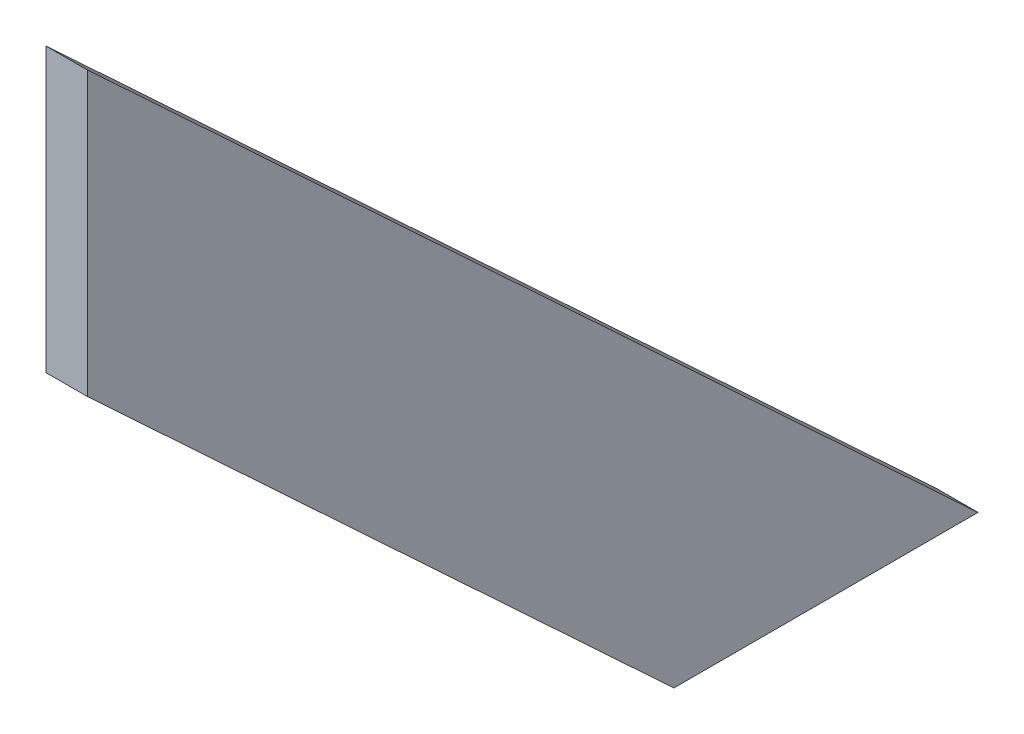
ISO-10303-21;
HEADER;
FILE_DESCRIPTION(('STEP AP214'),'2;1');
FILE_NAME('part.step','',(''),(''),'','','');
FILE_SCHEMA(('AUTOMOTIVE_DESIGN { 1 0 10303 214 1 1 1 1 }'));
ENDSEC;
DATA;
#1=APPLICATION_CONTEXT('core data for automotive mechanical design processes');
#2=APPLICATION_PROTOCOL_DEFINITION('international standard','automotive_design',2000,#1);
#3=PRODUCT_CONTEXT('',#1,'mechanical');
#4=PRODUCT('Part','Part','',(#3));
#5=PRODUCT_RELATED_PRODUCT_CATEGORY('part','',(#4));
#6=PRODUCT_DEFINITION_FORMATION('','',#4);
#7=PRODUCT_DEFINITION_CONTEXT('part definition',#1,'design');
#8=PRODUCT_DEFINITION('design','',#6,#7);
#9=PRODUCT_DEFINITION_SHAPE('','',#8);
#10=(LENGTH_UNIT() NAMED_UNIT(*) SI_UNIT(.MILLI.,.METRE.));
#11=(NAMED_UNIT(*) PLANE_ANGLE_UNIT() SI_UNIT($,.RADIAN.));
#12=(NAMED_UNIT(*) SI_UNIT($,.STERADIAN.) SOLID_ANGLE_UNIT());
#13=UNCERTAINTY_MEASURE_WITH_UNIT(LENGTH_MEASURE(1.E-05),#10,'distance_accuracy_value','');
#14=(GEOMETRIC_REPRESENTATION_CONTEXT(3) GLOBAL_UNCERTAINTY_ASSIGNED_CONTEXT((#13)) GLOBAL_UNIT_ASSIGNED_CONTEXT((#10,
#11,#12)) REPRESENTATION_CONTEXT('',''));
#15=CARTESIAN_POINT('',(0.,0.,0.));
#16=DIRECTION('',(0.,0.,1.));
#17=DIRECTION('',(1.,0.,0.));
#18=AXIS2_PLACEMENT_3D('',#15,#16,#17);
#19=CARTESIAN_POINT('',(2.,0.,-43.));
#20=DIRECTION('',(0.,-0.732186738163084,0.681103942477287));
#21=DIRECTION('',(0.,-0.681103942477287,-0.732186738163084));
#22=AXIS2_PLACEMENT_3D('',#19,#20,#21);
#23=PLANE('',#22);
#24=DIRECTION('',(0.,0.681103942477287,0.732186738163084));
#25=VECTOR('',#24,1.);
#26=CARTESIAN_POINT('',(0.,0.,-43.));
#27=LINE('',#26,#25);
#28=CARTESIAN_POINT('',(0.,0.,-43.));
#29=VERTEX_POINT('',#28);
#30=CARTESIAN_POINT('',(0.,40.,0.));
#31=VERTEX_POINT('',#30);
#32=EDGE_CURVE('E107',#29,#31,#27,.T.);
#33=ORIENTED_EDGE('',*,*,#32,.T.);
#34=DIRECTION('',(-1.,0.,0.));
#35=VECTOR('',#34,1.);
#36=CARTESIAN_POINT('',(2.,40.,0.));
#37=LINE('',#36,#35);
#38=CARTESIAN_POINT('',(2.,40.,0.));
#39=VERTEX_POINT('',#38);
#40=EDGE_CURVE('E11',#39,#31,#37,.T.);
#41=ORIENTED_EDGE('',*,*,#40,.F.);
#42=DIRECTION('',(0.,0.681103942477287,0.732186738163084));
#43=VECTOR('',#42,1.);
#44=CARTESIAN_POINT('',(2.,0.,-43.));
#45=LINE('',#44,#43);
#46=CARTESIAN_POINT('',(2.,0.,-43.));
#47=VERTEX_POINT('',#46);
#48=EDGE_CURVE('E91',#47,#39,#45,.T.);
#49=ORIENTED_EDGE('',*,*,#48,.F.);
#50=DIRECTION('',(-1.,0.,0.));
#51=VECTOR('',#50,1.);
#52=CARTESIAN_POINT('',(2.,0.,-43.));
#53=LINE('',#52,#51);
#54=EDGE_CURVE('E103',#47,#29,#53,.T.);
#55=ORIENTED_EDGE('',*,*,#54,.T.);
#56=EDGE_LOOP('',(#33,#41,#49,#55));
#57=FACE_BOUND('',#56,.T.);
#58=ADVANCED_FACE('F39',(#57),#23,.F.);
#59=CARTESIAN_POINT('',(2.,40.,0.));
#60=DIRECTION('',(0.,0.,-1.));
#61=DIRECTION('',(0.,1.,0.));
#62=AXIS2_PLACEMENT_3D('',#59,#60,#61);
#63=PLANE('',#62);
#64=DIRECTION('',(0.,-1.,0.));
#65=VECTOR('',#64,1.);
#66=CARTESIAN_POINT('',(0.,40.,0.));
#67=LINE('',#66,#65);
#68=CARTESIAN_POINT('',(0.,26.3422819906735,0.));
#69=VERTEX_POINT('',#68);
#70=EDGE_CURVE('E96',#31,#69,#67,.T.);
#71=ORIENTED_EDGE('',*,*,#70,.T.);
#72=DIRECTION('',(-1.,0.,0.));
#73=VECTOR('',#72,1.);
#74=CARTESIAN_POINT('',(2.,26.3422819906735,0.));
#75=LINE('',#74,#73);
#76=CARTESIAN_POINT('',(2.,26.3422819906735,0.));
#77=VERTEX_POINT('',#76);
#78=EDGE_CURVE('E48',#77,#69,#75,.T.);
#79=ORIENTED_EDGE('',*,*,#78,.F.);
#80=DIRECTION('',(0.,-1.,0.));
#81=VECTOR('',#80,1.);
#82=CARTESIAN_POINT('',(2.,40.,0.));
#83=LINE('',#82,#81);
#84=EDGE_CURVE('E86',#39,#77,#83,.T.);
#85=ORIENTED_EDGE('',*,*,#84,.F.);
#86=ORIENTED_EDGE('',*,*,#40,.T.);
#87=EDGE_LOOP('',(#71,#79,#85,#86));
#88=FACE_BOUND('',#87,.T.);
#89=ADVANCED_FACE('F95',(#88),#63,.F.);
#90=CARTESIAN_POINT('',(2.,26.3422819906735,0.));
#91=DIRECTION('',(0.,0.732186738163084,-0.681103942477287));
#92=DIRECTION('',(0.,0.681103942477287,0.732186738163084));
#93=AXIS2_PLACEMENT_3D('',#90,#91,#92);
#94=PLANE('',#93);
#95=DIRECTION('',(0.,-0.681103942477287,-0.732186738163084));
#96=VECTOR('',#95,1.);
#97=CARTESIAN_POINT('',(0.,26.3422819906735,0.));
#98=LINE('',#97,#96);
#99=CARTESIAN_POINT('',(0.,0.,-28.317953139974));
#100=VERTEX_POINT('',#99);
#101=EDGE_CURVE('E73',#69,#100,#98,.T.);
#102=ORIENTED_EDGE('',*,*,#101,.T.);
#103=DIRECTION('',(-1.,0.,0.));
#104=VECTOR('',#103,1.);
#105=CARTESIAN_POINT('',(2.,0.,-28.317953139974));
#106=LINE('',#105,#104);
#107=CARTESIAN_POINT('',(2.,0.,-28.317953139974));
#108=VERTEX_POINT('',#107);
#109=EDGE_CURVE('E98',#108,#100,#106,.T.);
#110=ORIENTED_EDGE('',*,*,#109,.F.);
#111=DIRECTION('',(0.,-0.681103942477287,-0.732186738163084));
#112=VECTOR('',#111,1.);
#113=CARTESIAN_POINT('',(2.,26.3422819906735,0.));
#114=LINE('',#113,#112);
#115=EDGE_CURVE('E89',#77,#108,#114,.T.);
#116=ORIENTED_EDGE('',*,*,#115,.F.);
#117=ORIENTED_EDGE('',*,*,#78,.T.);
#118=EDGE_LOOP('',(#102,#110,#116,#117));
#119=FACE_BOUND('',#118,.T.);
#120=ADVANCED_FACE('F99',(#119),#94,.F.);
#121=CARTESIAN_POINT('',(2.,0.,-28.317953139974));
#122=DIRECTION('',(0.,1.,0.));
#123=DIRECTION('',(0.,0.,1.));
#124=AXIS2_PLACEMENT_3D('',#121,#122,#123);
#125=PLANE('',#124);
#126=DIRECTION('',(0.,0.,-1.));
#127=VECTOR('',#126,1.);
#128=CARTESIAN_POINT('',(0.,0.,-28.317953139974));
#129=LINE('',#128,#127);
#130=EDGE_CURVE('E79',#100,#29,#129,.T.);
#131=ORIENTED_EDGE('',*,*,#130,.T.);
#132=ORIENTED_EDGE('',*,*,#54,.F.);
#133=DIRECTION('',(0.,0.,-1.));
#134=VECTOR('',#133,1.);
#135=CARTESIAN_POINT('',(2.,0.,-28.317953139974));
#136=LINE('',#135,#134);
#137=EDGE_CURVE('E56',#108,#47,#136,.T.);
#138=ORIENTED_EDGE('',*,*,#137,.F.);
#139=ORIENTED_EDGE('',*,*,#109,.T.);
#140=EDGE_LOOP('',(#131,#132,#138,#139));
#141=FACE_BOUND('',#140,.T.);
#142=ADVANCED_FACE('F120',(#141),#125,.F.);
#143=CARTESIAN_POINT('',(2.,0.,0.));
#144=DIRECTION('',(1.,0.,0.));
#145=DIRECTION('',(0.,0.,-1.));
#146=AXIS2_PLACEMENT_3D('',#143,#144,#145);
#147=PLANE('',#146);
#148=ORIENTED_EDGE('',*,*,#48,.T.);
#149=ORIENTED_EDGE('',*,*,#84,.T.);
#150=ORIENTED_EDGE('',*,*,#115,.T.);
#151=ORIENTED_EDGE('',*,*,#137,.T.);
#152=EDGE_LOOP('',(#148,#149,#150,#151));
#153=FACE_BOUND('',#152,.T.);
#154=ADVANCED_FACE('F87',(#153),#147,.T.);
#155=CARTESIAN_POINT('',(0.,0.,0.));
#156=DIRECTION('',(1.,0.,0.));
#157=DIRECTION('',(0.,0.,-1.));
#158=AXIS2_PLACEMENT_3D('',#155,#156,#157);
#159=PLANE('',#158);
#160=ORIENTED_EDGE('',*,*,#32,.F.);
#161=ORIENTED_EDGE('',*,*,#130,.F.);
#162=ORIENTED_EDGE('',*,*,#101,.F.);
#163=ORIENTED_EDGE('',*,*,#70,.F.);
#164=EDGE_LOOP('',(#160,#161,#162,#163));
#165=FACE_BOUND('',#164,.T.);
#166=ADVANCED_FACE('F123',(#165),#159,.F.);
#167=CLOSED_SHELL('',(#58,#89,#120,#142,#154,#166));
#168=MANIFOLD_SOLID_BREP('B2',#167);
#169=ADVANCED_BREP_SHAPE_REPRESENTATION('',(#18,#168),#14);
#170=SHAPE_DEFINITION_REPRESENTATION(#9,#169);
ENDSEC;
END-ISO-10303-21;
